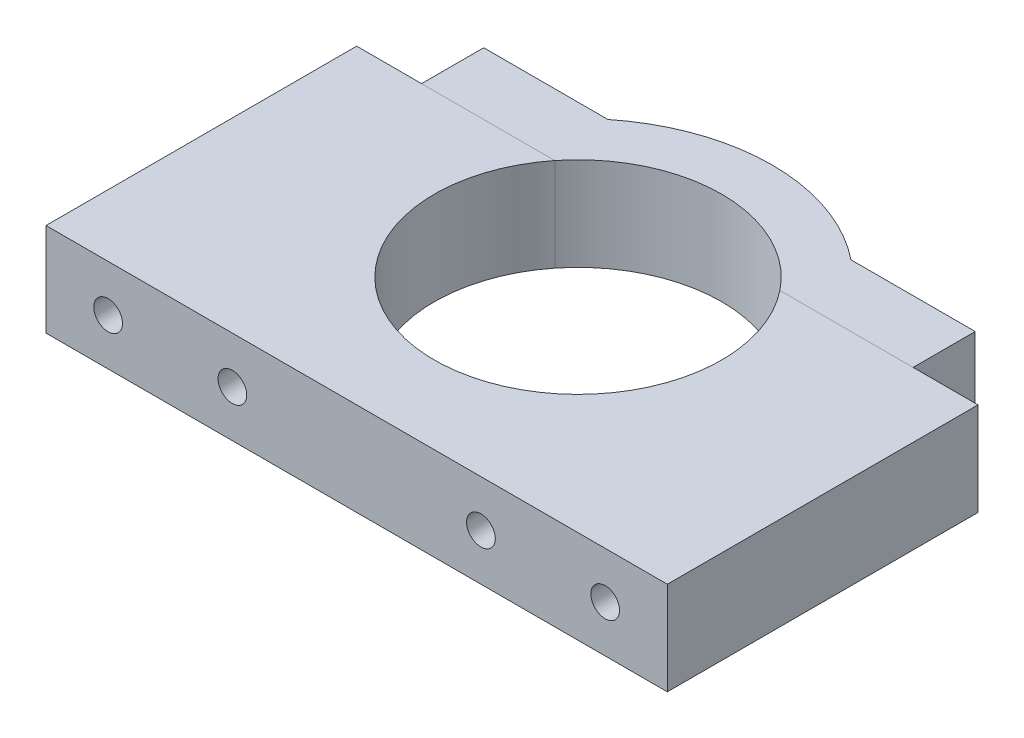
ISO-10303-21;
HEADER;
FILE_DESCRIPTION(('STEP AP214'),'2;1');
FILE_NAME('part.step','',(''),(''),'','','');
FILE_SCHEMA(('AUTOMOTIVE_DESIGN { 1 0 10303 214 1 1 1 1 }'));
ENDSEC;
DATA;
#1=APPLICATION_CONTEXT('core data for automotive mechanical design processes');
#2=APPLICATION_PROTOCOL_DEFINITION('international standard','automotive_design',2000,#1);
#3=PRODUCT_CONTEXT('',#1,'mechanical');
#4=PRODUCT('Part','Part','',(#3));
#5=PRODUCT_RELATED_PRODUCT_CATEGORY('part','',(#4));
#6=PRODUCT_DEFINITION_FORMATION('','',#4);
#7=PRODUCT_DEFINITION_CONTEXT('part definition',#1,'design');
#8=PRODUCT_DEFINITION('design','',#6,#7);
#9=PRODUCT_DEFINITION_SHAPE('','',#8);
#10=(LENGTH_UNIT() NAMED_UNIT(*) SI_UNIT(.MILLI.,.METRE.));
#11=(NAMED_UNIT(*) PLANE_ANGLE_UNIT() SI_UNIT($,.RADIAN.));
#12=(NAMED_UNIT(*) SI_UNIT($,.STERADIAN.) SOLID_ANGLE_UNIT());
#13=UNCERTAINTY_MEASURE_WITH_UNIT(LENGTH_MEASURE(1.E-05),#10,'distance_accuracy_value','');
#14=(GEOMETRIC_REPRESENTATION_CONTEXT(3) GLOBAL_UNCERTAINTY_ASSIGNED_CONTEXT((#13)) GLOBAL_UNIT_ASSIGNED_CONTEXT((#10,
#11,#12)) REPRESENTATION_CONTEXT('',''));
#15=CARTESIAN_POINT('',(0.,0.,0.));
#16=DIRECTION('',(0.,0.,1.));
#17=DIRECTION('',(1.,0.,0.));
#18=AXIS2_PLACEMENT_3D('',#15,#16,#17);
#19=CARTESIAN_POINT('',(0.,6.,-19.5));
#20=DIRECTION('',(0.,0.,1.));
#21=DIRECTION('',(1.,0.,0.));
#22=AXIS2_PLACEMENT_3D('',#19,#20,#21);
#23=PLANE('',#22);
#24=DIRECTION('',(-1.,0.,0.));
#25=VECTOR('',#24,1.);
#26=CARTESIAN_POINT('',(0.,-6.,-19.5));
#27=LINE('',#26,#25);
#28=CARTESIAN_POINT('',(31.644487847162,-6.,-19.5));
#29=VERTEX_POINT('',#28);
#30=CARTESIAN_POINT('',(15.644487847162,-6.,-19.5));
#31=VERTEX_POINT('',#30);
#32=EDGE_CURVE('E140',#29,#31,#27,.T.);
#33=ORIENTED_EDGE('',*,*,#32,.T.);
#34=DIRECTION('',(0.,-1.,0.));
#35=VECTOR('',#34,1.);
#36=CARTESIAN_POINT('',(15.644487847162,6.,-19.5));
#37=LINE('',#36,#35);
#38=CARTESIAN_POINT('',(15.644487847162,6.,-19.5));
#39=VERTEX_POINT('',#38);
#40=EDGE_CURVE('E12',#39,#31,#37,.T.);
#41=ORIENTED_EDGE('',*,*,#40,.F.);
#42=DIRECTION('',(-1.,0.,0.));
#43=VECTOR('',#42,1.);
#44=CARTESIAN_POINT('',(0.,6.,-19.5));
#45=LINE('',#44,#43);
#46=CARTESIAN_POINT('',(31.644487847162,6.,-19.5));
#47=VERTEX_POINT('',#46);
#48=EDGE_CURVE('E159',#47,#39,#45,.T.);
#49=ORIENTED_EDGE('',*,*,#48,.F.);
#50=DIRECTION('',(0.,-1.,0.));
#51=VECTOR('',#50,1.);
#52=CARTESIAN_POINT('',(31.644487847162,6.,-19.5));
#53=LINE('',#52,#51);
#54=EDGE_CURVE('E136',#47,#29,#53,.T.);
#55=ORIENTED_EDGE('',*,*,#54,.T.);
#56=EDGE_LOOP('',(#33,#41,#49,#55));
#57=FACE_BOUND('',#56,.T.);
#58=ADVANCED_FACE('F45',(#57),#23,.F.);
#59=CARTESIAN_POINT('',(0.,6.,0.));
#60=DIRECTION('',(0.,-1.,0.));
#61=DIRECTION('',(0.,0.,-1.));
#62=AXIS2_PLACEMENT_3D('',#59,#60,#61);
#63=CYLINDRICAL_SURFACE('',#62,25.);
#64=CARTESIAN_POINT('',(0.,-6.,0.));
#65=DIRECTION('',(0.,1.,0.));
#66=DIRECTION('',(0.,0.,1.));
#67=AXIS2_PLACEMENT_3D('',#64,#65,#66);
#68=CIRCLE('',#67,25.);
#69=CARTESIAN_POINT('',(-15.644487847162,-6.,-19.5));
#70=VERTEX_POINT('',#69);
#71=EDGE_CURVE('E143',#31,#70,#68,.T.);
#72=ORIENTED_EDGE('',*,*,#71,.T.);
#73=DIRECTION('',(0.,-1.,0.));
#74=VECTOR('',#73,1.);
#75=CARTESIAN_POINT('',(-15.644487847162,6.,-19.5));
#76=LINE('',#75,#74);
#77=CARTESIAN_POINT('',(-15.644487847162,6.,-19.5));
#78=VERTEX_POINT('',#77);
#79=EDGE_CURVE('E53',#78,#70,#76,.T.);
#80=ORIENTED_EDGE('',*,*,#79,.F.);
#81=CARTESIAN_POINT('',(0.,6.,0.));
#82=DIRECTION('',(0.,1.,0.));
#83=DIRECTION('',(0.,0.,1.));
#84=AXIS2_PLACEMENT_3D('',#81,#82,#83);
#85=CIRCLE('',#84,25.);
#86=EDGE_CURVE('E100',#39,#78,#85,.T.);
#87=ORIENTED_EDGE('',*,*,#86,.F.);
#88=ORIENTED_EDGE('',*,*,#40,.T.);
#89=EDGE_LOOP('',(#72,#80,#87,#88));
#90=FACE_BOUND('',#89,.T.);
#91=ADVANCED_FACE('F172',(#90),#63,.T.);
#92=CARTESIAN_POINT('',(0.,6.,-19.5));
#93=DIRECTION('',(0.,0.,-1.));
#94=DIRECTION('',(-1.,0.,0.));
#95=AXIS2_PLACEMENT_3D('',#92,#93,#94);
#96=PLANE('',#95);
#97=DIRECTION('',(1.,0.,0.));
#98=VECTOR('',#97,1.);
#99=CARTESIAN_POINT('',(0.,-6.,-19.5));
#100=LINE('',#99,#98);
#101=CARTESIAN_POINT('',(-31.644487847162,-6.,-19.5));
#102=VERTEX_POINT('',#101);
#103=EDGE_CURVE('E146',#102,#70,#100,.T.);
#104=ORIENTED_EDGE('',*,*,#103,.F.);
#105=DIRECTION('',(0.,-1.,0.));
#106=VECTOR('',#105,1.);
#107=CARTESIAN_POINT('',(-31.644487847162,6.,-19.5));
#108=LINE('',#107,#106);
#109=CARTESIAN_POINT('',(-31.644487847162,6.,-19.5));
#110=VERTEX_POINT('',#109);
#111=EDGE_CURVE('E165',#110,#102,#108,.T.);
#112=ORIENTED_EDGE('',*,*,#111,.F.);
#113=DIRECTION('',(1.,0.,0.));
#114=VECTOR('',#113,1.);
#115=CARTESIAN_POINT('',(0.,6.,-19.5));
#116=LINE('',#115,#114);
#117=EDGE_CURVE('E171',#110,#78,#116,.T.);
#118=ORIENTED_EDGE('',*,*,#117,.T.);
#119=ORIENTED_EDGE('',*,*,#79,.T.);
#120=EDGE_LOOP('',(#104,#112,#118,#119));
#121=FACE_BOUND('',#120,.T.);
#122=ADVANCED_FACE('F169',(#121),#96,.T.);
#123=CARTESIAN_POINT('',(-31.644487847162,6.,0.));
#124=DIRECTION('',(-1.,0.,0.));
#125=DIRECTION('',(0.,0.,1.));
#126=AXIS2_PLACEMENT_3D('',#123,#124,#125);
#127=PLANE('',#126);
#128=DIRECTION('',(0.,0.,-1.));
#129=VECTOR('',#128,1.);
#130=CARTESIAN_POINT('',(-31.644487847162,-6.,0.));
#131=LINE('',#130,#129);
#132=CARTESIAN_POINT('',(-31.644487847162,-6.,-11.5));
#133=VERTEX_POINT('',#132);
#134=EDGE_CURVE('E149',#133,#102,#131,.T.);
#135=ORIENTED_EDGE('',*,*,#134,.F.);
#136=DIRECTION('',(0.,-1.,0.));
#137=VECTOR('',#136,1.);
#138=CARTESIAN_POINT('',(-31.644487847162,6.,-11.5));
#139=LINE('',#138,#137);
#140=CARTESIAN_POINT('',(-31.644487847162,6.,-11.5));
#141=VERTEX_POINT('',#140);
#142=EDGE_CURVE('E163',#141,#133,#139,.T.);
#143=ORIENTED_EDGE('',*,*,#142,.F.);
#144=DIRECTION('',(0.,0.,-1.));
#145=VECTOR('',#144,1.);
#146=CARTESIAN_POINT('',(-31.644487847162,6.,0.));
#147=LINE('',#146,#145);
#148=EDGE_CURVE('E182',#141,#110,#147,.T.);
#149=ORIENTED_EDGE('',*,*,#148,.T.);
#150=ORIENTED_EDGE('',*,*,#111,.T.);
#151=EDGE_LOOP('',(#135,#143,#149,#150));
#152=FACE_BOUND('',#151,.T.);
#153=ADVANCED_FACE('F180',(#152),#127,.T.);
#154=CARTESIAN_POINT('',(0.,6.,-11.5));
#155=DIRECTION('',(0.,0.,-1.));
#156=DIRECTION('',(-1.,0.,0.));
#157=AXIS2_PLACEMENT_3D('',#154,#155,#156);
#158=PLANE('',#157);
#159=DIRECTION('',(1.,0.,0.));
#160=VECTOR('',#159,1.);
#161=CARTESIAN_POINT('',(0.,-6.,-11.5));
#162=LINE('',#161,#160);
#163=CARTESIAN_POINT('',(-14.4913767461894,-6.,-11.5));
#164=VERTEX_POINT('',#163);
#165=EDGE_CURVE('E152',#133,#164,#162,.T.);
#166=ORIENTED_EDGE('',*,*,#165,.T.);
#167=DIRECTION('',(0.,-1.,0.));
#168=VECTOR('',#167,1.);
#169=CARTESIAN_POINT('',(-14.4913767461894,6.,-11.5));
#170=LINE('',#169,#168);
#171=CARTESIAN_POINT('',(-14.4913767461894,6.,-11.5));
#172=VERTEX_POINT('',#171);
#173=EDGE_CURVE('E125',#172,#164,#170,.T.);
#174=ORIENTED_EDGE('',*,*,#173,.F.);
#175=DIRECTION('',(1.,0.,0.));
#176=VECTOR('',#175,1.);
#177=CARTESIAN_POINT('',(0.,6.,-11.5));
#178=LINE('',#177,#176);
#179=EDGE_CURVE('E131',#141,#172,#178,.T.);
#180=ORIENTED_EDGE('',*,*,#179,.F.);
#181=ORIENTED_EDGE('',*,*,#142,.T.);
#182=EDGE_LOOP('',(#166,#174,#180,#181));
#183=FACE_BOUND('',#182,.T.);
#184=ADVANCED_FACE('F210',(#183),#158,.F.);
#185=CARTESIAN_POINT('',(0.,6.,0.));
#186=DIRECTION('',(0.,-1.,0.));
#187=DIRECTION('',(0.,0.,-1.));
#188=AXIS2_PLACEMENT_3D('',#185,#186,#187);
#189=CYLINDRICAL_SURFACE('',#188,18.5);
#190=CARTESIAN_POINT('',(0.,-6.,0.));
#191=DIRECTION('',(0.,1.,0.));
#192=DIRECTION('',(0.,0.,1.));
#193=AXIS2_PLACEMENT_3D('',#190,#191,#192);
#194=CIRCLE('',#193,18.5);
#195=CARTESIAN_POINT('',(14.4913767461894,-6.,-11.5));
#196=VERTEX_POINT('',#195);
#197=EDGE_CURVE('E120',#196,#164,#194,.T.);
#198=ORIENTED_EDGE('',*,*,#197,.F.);
#199=DIRECTION('',(0.,-1.,0.));
#200=VECTOR('',#199,1.);
#201=CARTESIAN_POINT('',(14.4913767461894,6.,-11.5));
#202=LINE('',#201,#200);
#203=CARTESIAN_POINT('',(14.4913767461894,6.,-11.5));
#204=VERTEX_POINT('',#203);
#205=EDGE_CURVE('E115',#204,#196,#202,.T.);
#206=ORIENTED_EDGE('',*,*,#205,.F.);
#207=CARTESIAN_POINT('',(0.,6.,0.));
#208=DIRECTION('',(0.,1.,0.));
#209=DIRECTION('',(0.,0.,1.));
#210=AXIS2_PLACEMENT_3D('',#207,#208,#209);
#211=CIRCLE('',#210,18.5);
#212=EDGE_CURVE('E118',#204,#172,#211,.T.);
#213=ORIENTED_EDGE('',*,*,#212,.T.);
#214=ORIENTED_EDGE('',*,*,#173,.T.);
#215=EDGE_LOOP('',(#198,#206,#213,#214));
#216=FACE_BOUND('',#215,.T.);
#217=ADVANCED_FACE('F117',(#216),#189,.F.);
#218=CARTESIAN_POINT('',(0.,6.,-11.5));
#219=DIRECTION('',(0.,0.,1.));
#220=DIRECTION('',(1.,0.,0.));
#221=AXIS2_PLACEMENT_3D('',#218,#219,#220);
#222=PLANE('',#221);
#223=DIRECTION('',(-1.,0.,0.));
#224=VECTOR('',#223,1.);
#225=CARTESIAN_POINT('',(0.,-6.,-11.5));
#226=LINE('',#225,#224);
#227=CARTESIAN_POINT('',(31.644487847162,-6.,-11.5));
#228=VERTEX_POINT('',#227);
#229=EDGE_CURVE('E156',#228,#196,#226,.T.);
#230=ORIENTED_EDGE('',*,*,#229,.F.);
#231=DIRECTION('',(0.,-1.,0.));
#232=VECTOR('',#231,1.);
#233=CARTESIAN_POINT('',(31.644487847162,6.,-11.5));
#234=LINE('',#233,#232);
#235=CARTESIAN_POINT('',(31.644487847162,6.,-11.5));
#236=VERTEX_POINT('',#235);
#237=EDGE_CURVE('E89',#236,#228,#234,.T.);
#238=ORIENTED_EDGE('',*,*,#237,.F.);
#239=DIRECTION('',(-1.,0.,0.));
#240=VECTOR('',#239,1.);
#241=CARTESIAN_POINT('',(0.,6.,-11.5));
#242=LINE('',#241,#240);
#243=EDGE_CURVE('E128',#236,#204,#242,.T.);
#244=ORIENTED_EDGE('',*,*,#243,.T.);
#245=ORIENTED_EDGE('',*,*,#205,.T.);
#246=EDGE_LOOP('',(#230,#238,#244,#245));
#247=FACE_BOUND('',#246,.T.);
#248=ADVANCED_FACE('F134',(#247),#222,.T.);
#249=CARTESIAN_POINT('',(31.644487847162,6.,0.));
#250=DIRECTION('',(-1.,0.,0.));
#251=DIRECTION('',(0.,0.,1.));
#252=AXIS2_PLACEMENT_3D('',#249,#250,#251);
#253=PLANE('',#252);
#254=DIRECTION('',(0.,0.,-1.));
#255=VECTOR('',#254,1.);
#256=CARTESIAN_POINT('',(31.644487847162,-6.,0.));
#257=LINE('',#256,#255);
#258=EDGE_CURVE('E92',#228,#29,#257,.T.);
#259=ORIENTED_EDGE('',*,*,#258,.T.);
#260=ORIENTED_EDGE('',*,*,#54,.F.);
#261=DIRECTION('',(0.,0.,-1.));
#262=VECTOR('',#261,1.);
#263=CARTESIAN_POINT('',(31.644487847162,6.,0.));
#264=LINE('',#263,#262);
#265=EDGE_CURVE('E61',#236,#47,#264,.T.);
#266=ORIENTED_EDGE('',*,*,#265,.F.);
#267=ORIENTED_EDGE('',*,*,#237,.T.);
#268=EDGE_LOOP('',(#259,#260,#266,#267));
#269=FACE_BOUND('',#268,.T.);
#270=ADVANCED_FACE('F189',(#269),#253,.F.);
#271=CARTESIAN_POINT('',(0.,6.,0.));
#272=DIRECTION('',(0.,1.,0.));
#273=DIRECTION('',(0.,0.,1.));
#274=AXIS2_PLACEMENT_3D('',#271,#272,#273);
#275=PLANE('',#274);
#276=ORIENTED_EDGE('',*,*,#48,.T.);
#277=ORIENTED_EDGE('',*,*,#86,.T.);
#278=ORIENTED_EDGE('',*,*,#117,.F.);
#279=ORIENTED_EDGE('',*,*,#148,.F.);
#280=ORIENTED_EDGE('',*,*,#179,.T.);
#281=ORIENTED_EDGE('',*,*,#212,.F.);
#282=ORIENTED_EDGE('',*,*,#243,.F.);
#283=ORIENTED_EDGE('',*,*,#265,.T.);
#284=EDGE_LOOP('',(#276,#277,#278,#279,#280,#281,#282,#283));
#285=FACE_BOUND('',#284,.T.);
#286=ADVANCED_FACE('F127',(#285),#275,.T.);
#287=CARTESIAN_POINT('',(0.,-6.,0.));
#288=DIRECTION('',(0.,1.,0.));
#289=DIRECTION('',(0.,0.,1.));
#290=AXIS2_PLACEMENT_3D('',#287,#288,#289);
#291=PLANE('',#290);
#292=ORIENTED_EDGE('',*,*,#32,.F.);
#293=ORIENTED_EDGE('',*,*,#258,.F.);
#294=ORIENTED_EDGE('',*,*,#229,.T.);
#295=ORIENTED_EDGE('',*,*,#197,.T.);
#296=ORIENTED_EDGE('',*,*,#165,.F.);
#297=ORIENTED_EDGE('',*,*,#134,.T.);
#298=ORIENTED_EDGE('',*,*,#103,.T.);
#299=ORIENTED_EDGE('',*,*,#71,.F.);
#300=EDGE_LOOP('',(#292,#293,#294,#295,#296,#297,#298,#299));
#301=FACE_BOUND('',#300,.T.);
#302=ADVANCED_FACE('F176',(#301),#291,.F.);
#303=CLOSED_SHELL('',(#58,#91,#122,#153,#184,#217,#248,#270,#286,#302));
#304=MANIFOLD_SOLID_BREP('B2',#303);
#305=CARTESIAN_POINT('',(0.,6.,0.));
#306=DIRECTION('',(0.,-1.,0.));
#307=DIRECTION('',(0.,0.,-1.));
#308=AXIS2_PLACEMENT_3D('',#305,#306,#307);
#309=CYLINDRICAL_SURFACE('',#308,18.5);
#310=CARTESIAN_POINT('',(0.,-6.,0.));
#311=DIRECTION('',(0.,1.,0.));
#312=DIRECTION('',(0.,0.,1.));
#313=AXIS2_PLACEMENT_3D('',#310,#311,#312);
#314=CIRCLE('',#313,18.5);
#315=CARTESIAN_POINT('',(-14.4913767461894,-6.,-11.5));
#316=VERTEX_POINT('',#315);
#317=CARTESIAN_POINT('',(14.4913767461894,-6.,-11.5));
#318=VERTEX_POINT('',#317);
#319=EDGE_CURVE('E353',#316,#318,#314,.T.);
#320=ORIENTED_EDGE('',*,*,#319,.F.);
#321=DIRECTION('',(0.,-1.,0.));
#322=VECTOR('',#321,1.);
#323=CARTESIAN_POINT('',(-14.4913767461894,6.,-11.5));
#324=LINE('',#323,#322);
#325=CARTESIAN_POINT('',(-14.4913767461894,6.,-11.5));
#326=VERTEX_POINT('',#325);
#327=EDGE_CURVE('E43',#326,#316,#324,.T.);
#328=ORIENTED_EDGE('',*,*,#327,.F.);
#329=CARTESIAN_POINT('',(0.,6.,0.));
#330=DIRECTION('',(0.,1.,0.));
#331=DIRECTION('',(0.,0.,1.));
#332=AXIS2_PLACEMENT_3D('',#329,#330,#331);
#333=CIRCLE('',#332,18.5);
#334=CARTESIAN_POINT('',(14.4913767461894,6.,-11.5));
#335=VERTEX_POINT('',#334);
#336=EDGE_CURVE('E367',#326,#335,#333,.T.);
#337=ORIENTED_EDGE('',*,*,#336,.T.);
#338=DIRECTION('',(0.,-1.,0.));
#339=VECTOR('',#338,1.);
#340=CARTESIAN_POINT('',(14.4913767461894,6.,-11.5));
#341=LINE('',#340,#339);
#342=EDGE_CURVE('E318',#335,#318,#341,.T.);
#343=ORIENTED_EDGE('',*,*,#342,.T.);
#344=EDGE_LOOP('',(#320,#328,#337,#343));
#345=FACE_BOUND('',#344,.T.);
#346=ADVANCED_FACE('F273',(#345),#309,.F.);
#347=CARTESIAN_POINT('',(0.,6.,-11.5));
#348=DIRECTION('',(0.,0.,-1.));
#349=DIRECTION('',(-1.,0.,0.));
#350=AXIS2_PLACEMENT_3D('',#347,#348,#349);
#351=PLANE('',#350);
#352=DIRECTION('',(1.,0.,0.));
#353=VECTOR('',#352,1.);
#354=CARTESIAN_POINT('',(0.,-6.,-11.5));
#355=LINE('',#354,#353);
#356=CARTESIAN_POINT('',(-40.,-6.,-11.5));
#357=VERTEX_POINT('',#356);
#358=EDGE_CURVE('E356',#357,#316,#355,.T.);
#359=ORIENTED_EDGE('',*,*,#358,.F.);
#360=DIRECTION('',(0.,-1.,0.));
#361=VECTOR('',#360,1.);
#362=CARTESIAN_POINT('',(-40.,6.,-11.5));
#363=LINE('',#362,#361);
#364=CARTESIAN_POINT('',(-40.,6.,-11.5));
#365=VERTEX_POINT('',#364);
#366=EDGE_CURVE('E281',#365,#357,#363,.T.);
#367=ORIENTED_EDGE('',*,*,#366,.F.);
#368=DIRECTION('',(1.,0.,0.));
#369=VECTOR('',#368,1.);
#370=CARTESIAN_POINT('',(0.,6.,-11.5));
#371=LINE('',#370,#369);
#372=EDGE_CURVE('E382',#365,#326,#371,.T.);
#373=ORIENTED_EDGE('',*,*,#372,.T.);
#374=ORIENTED_EDGE('',*,*,#327,.T.);
#375=EDGE_LOOP('',(#359,#367,#373,#374));
#376=FACE_BOUND('',#375,.T.);
#377=ADVANCED_FACE('F376',(#376),#351,.T.);
#378=CARTESIAN_POINT('',(-40.,6.,0.));
#379=DIRECTION('',(-1.,0.,0.));
#380=DIRECTION('',(0.,0.,1.));
#381=AXIS2_PLACEMENT_3D('',#378,#379,#380);
#382=PLANE('',#381);
#383=DIRECTION('',(0.,0.,-1.));
#384=VECTOR('',#383,1.);
#385=CARTESIAN_POINT('',(-40.,-6.,0.));
#386=LINE('',#385,#384);
#387=CARTESIAN_POINT('',(-40.,-6.,28.5));
#388=VERTEX_POINT('',#387);
#389=EDGE_CURVE('E360',#388,#357,#386,.T.);
#390=ORIENTED_EDGE('',*,*,#389,.F.);
#391=DIRECTION('',(0.,-1.,0.));
#392=VECTOR('',#391,1.);
#393=CARTESIAN_POINT('',(-40.,6.,28.5));
#394=LINE('',#393,#392);
#395=CARTESIAN_POINT('',(-40.,6.,28.5));
#396=VERTEX_POINT('',#395);
#397=EDGE_CURVE('E345',#396,#388,#394,.T.);
#398=ORIENTED_EDGE('',*,*,#397,.F.);
#399=DIRECTION('',(0.,0.,-1.));
#400=VECTOR('',#399,1.);
#401=CARTESIAN_POINT('',(-40.,6.,0.));
#402=LINE('',#401,#400);
#403=EDGE_CURVE('E338',#396,#365,#402,.T.);
#404=ORIENTED_EDGE('',*,*,#403,.T.);
#405=ORIENTED_EDGE('',*,*,#366,.T.);
#406=EDGE_LOOP('',(#390,#398,#404,#405));
#407=FACE_BOUND('',#406,.T.);
#408=ADVANCED_FACE('F373',(#407),#382,.T.);
#409=CARTESIAN_POINT('',(0.,6.,28.5));
#410=DIRECTION('',(0.,0.,-1.));
#411=DIRECTION('',(-1.,0.,0.));
#412=AXIS2_PLACEMENT_3D('',#409,#410,#411);
#413=PLANE('',#412);
#414=CARTESIAN_POINT('',(-32.,0.,28.5));
#415=DIRECTION('',(0.,0.,1.));
#416=DIRECTION('',(-1.,0.,0.));
#417=AXIS2_PLACEMENT_3D('',#414,#415,#416);
#418=CIRCLE('',#417,1.85);
#419=CARTESIAN_POINT('',(-33.85,0.,28.5));
#420=VERTEX_POINT('',#419);
#421=EDGE_CURVE('E404',#420,#420,#418,.T.);
#422=ORIENTED_EDGE('',*,*,#421,.F.);
#423=EDGE_LOOP('',(#422));
#424=FACE_BOUND('',#423,.T.);
#425=CARTESIAN_POINT('',(-16.,0.,28.5));
#426=DIRECTION('',(0.,0.,1.));
#427=DIRECTION('',(-1.,0.,0.));
#428=AXIS2_PLACEMENT_3D('',#425,#426,#427);
#429=CIRCLE('',#428,1.85);
#430=CARTESIAN_POINT('',(-17.85,0.,28.5));
#431=VERTEX_POINT('',#430);
#432=EDGE_CURVE('E398',#431,#431,#429,.T.);
#433=ORIENTED_EDGE('',*,*,#432,.F.);
#434=EDGE_LOOP('',(#433));
#435=FACE_BOUND('',#434,.T.);
#436=CARTESIAN_POINT('',(16.,0.,28.5));
#437=DIRECTION('',(0.,0.,1.));
#438=DIRECTION('',(1.,0.,0.));
#439=AXIS2_PLACEMENT_3D('',#436,#437,#438);
#440=CIRCLE('',#439,1.85);
#441=CARTESIAN_POINT('',(17.85,0.,28.5));
#442=VERTEX_POINT('',#441);
#443=EDGE_CURVE('E392',#442,#442,#440,.T.);
#444=ORIENTED_EDGE('',*,*,#443,.F.);
#445=EDGE_LOOP('',(#444));
#446=FACE_BOUND('',#445,.T.);
#447=CARTESIAN_POINT('',(32.,0.,28.5));
#448=DIRECTION('',(0.,0.,1.));
#449=DIRECTION('',(1.,0.,0.));
#450=AXIS2_PLACEMENT_3D('',#447,#448,#449);
#451=CIRCLE('',#450,1.85);
#452=CARTESIAN_POINT('',(33.85,0.,28.5));
#453=VERTEX_POINT('',#452);
#454=EDGE_CURVE('E386',#453,#453,#451,.T.);
#455=ORIENTED_EDGE('',*,*,#454,.F.);
#456=EDGE_LOOP('',(#455));
#457=FACE_BOUND('',#456,.T.);
#458=DIRECTION('',(1.,0.,0.));
#459=VECTOR('',#458,1.);
#460=CARTESIAN_POINT('',(0.,-6.,28.5));
#461=LINE('',#460,#459);
#462=CARTESIAN_POINT('',(40.,-6.,28.5));
#463=VERTEX_POINT('',#462);
#464=EDGE_CURVE('E344',#388,#463,#461,.T.);
#465=ORIENTED_EDGE('',*,*,#464,.T.);
#466=DIRECTION('',(0.,-1.,0.));
#467=VECTOR('',#466,1.);
#468=CARTESIAN_POINT('',(40.,6.,28.5));
#469=LINE('',#468,#467);
#470=CARTESIAN_POINT('',(40.,6.,28.5));
#471=VERTEX_POINT('',#470);
#472=EDGE_CURVE('E341',#471,#463,#469,.T.);
#473=ORIENTED_EDGE('',*,*,#472,.F.);
#474=DIRECTION('',(1.,0.,0.));
#475=VECTOR('',#474,1.);
#476=CARTESIAN_POINT('',(0.,6.,28.5));
#477=LINE('',#476,#475);
#478=EDGE_CURVE('E331',#396,#471,#477,.T.);
#479=ORIENTED_EDGE('',*,*,#478,.F.);
#480=ORIENTED_EDGE('',*,*,#397,.T.);
#481=EDGE_LOOP('',(#465,#473,#479,#480));
#482=FACE_BOUND('',#481,.T.);
#483=ADVANCED_FACE('F342',(#424,#435,#446,#457,#482),#413,.F.);
#484=CARTESIAN_POINT('',(40.,6.,0.));
#485=DIRECTION('',(-1.,0.,0.));
#486=DIRECTION('',(0.,0.,1.));
#487=AXIS2_PLACEMENT_3D('',#484,#485,#486);
#488=PLANE('',#487);
#489=DIRECTION('',(0.,0.,-1.));
#490=VECTOR('',#489,1.);
#491=CARTESIAN_POINT('',(40.,-6.,0.));
#492=LINE('',#491,#490);
#493=CARTESIAN_POINT('',(40.,-6.,-11.5));
#494=VERTEX_POINT('',#493);
#495=EDGE_CURVE('E311',#463,#494,#492,.T.);
#496=ORIENTED_EDGE('',*,*,#495,.T.);
#497=DIRECTION('',(0.,-1.,0.));
#498=VECTOR('',#497,1.);
#499=CARTESIAN_POINT('',(40.,6.,-11.5));
#500=LINE('',#499,#498);
#501=CARTESIAN_POINT('',(40.,6.,-11.5));
#502=VERTEX_POINT('',#501);
#503=EDGE_CURVE('E346',#502,#494,#500,.T.);
#504=ORIENTED_EDGE('',*,*,#503,.F.);
#505=DIRECTION('',(0.,0.,-1.));
#506=VECTOR('',#505,1.);
#507=CARTESIAN_POINT('',(40.,6.,0.));
#508=LINE('',#507,#506);
#509=EDGE_CURVE('E335',#471,#502,#508,.T.);
#510=ORIENTED_EDGE('',*,*,#509,.F.);
#511=ORIENTED_EDGE('',*,*,#472,.T.);
#512=EDGE_LOOP('',(#496,#504,#510,#511));
#513=FACE_BOUND('',#512,.T.);
#514=ADVANCED_FACE('F348',(#513),#488,.F.);
#515=CARTESIAN_POINT('',(0.,6.,-11.5));
#516=DIRECTION('',(0.,0.,1.));
#517=DIRECTION('',(1.,0.,0.));
#518=AXIS2_PLACEMENT_3D('',#515,#516,#517);
#519=PLANE('',#518);
#520=DIRECTION('',(-1.,0.,0.));
#521=VECTOR('',#520,1.);
#522=CARTESIAN_POINT('',(0.,-6.,-11.5));
#523=LINE('',#522,#521);
#524=EDGE_CURVE('E365',#494,#318,#523,.T.);
#525=ORIENTED_EDGE('',*,*,#524,.T.);
#526=ORIENTED_EDGE('',*,*,#342,.F.);
#527=DIRECTION('',(-1.,0.,0.));
#528=VECTOR('',#527,1.);
#529=CARTESIAN_POINT('',(0.,6.,-11.5));
#530=LINE('',#529,#528);
#531=EDGE_CURVE('E289',#502,#335,#530,.T.);
#532=ORIENTED_EDGE('',*,*,#531,.F.);
#533=ORIENTED_EDGE('',*,*,#503,.T.);
#534=EDGE_LOOP('',(#525,#526,#532,#533));
#535=FACE_BOUND('',#534,.T.);
#536=ADVANCED_FACE('F381',(#535),#519,.F.);
#537=CARTESIAN_POINT('',(0.,6.,0.));
#538=DIRECTION('',(0.,1.,0.));
#539=DIRECTION('',(0.,0.,1.));
#540=AXIS2_PLACEMENT_3D('',#537,#538,#539);
#541=PLANE('',#540);
#542=ORIENTED_EDGE('',*,*,#336,.F.);
#543=ORIENTED_EDGE('',*,*,#372,.F.);
#544=ORIENTED_EDGE('',*,*,#403,.F.);
#545=ORIENTED_EDGE('',*,*,#478,.T.);
#546=ORIENTED_EDGE('',*,*,#509,.T.);
#547=ORIENTED_EDGE('',*,*,#531,.T.);
#548=EDGE_LOOP('',(#542,#543,#544,#545,#546,#547));
#549=FACE_BOUND('',#548,.T.);
#550=ADVANCED_FACE('F333',(#549),#541,.T.);
#551=CARTESIAN_POINT('',(0.,-6.,0.));
#552=DIRECTION('',(0.,1.,0.));
#553=DIRECTION('',(0.,0.,1.));
#554=AXIS2_PLACEMENT_3D('',#551,#552,#553);
#555=PLANE('',#554);
#556=ORIENTED_EDGE('',*,*,#319,.T.);
#557=ORIENTED_EDGE('',*,*,#524,.F.);
#558=ORIENTED_EDGE('',*,*,#495,.F.);
#559=ORIENTED_EDGE('',*,*,#464,.F.);
#560=ORIENTED_EDGE('',*,*,#389,.T.);
#561=ORIENTED_EDGE('',*,*,#358,.T.);
#562=EDGE_LOOP('',(#556,#557,#558,#559,#560,#561));
#563=FACE_BOUND('',#562,.T.);
#564=ADVANCED_FACE('F378',(#563),#555,.F.);
#565=CARTESIAN_POINT('',(32.,0.,20.5));
#566=DIRECTION('',(0.,0.,1.));
#567=DIRECTION('',(1.,0.,0.));
#568=AXIS2_PLACEMENT_3D('',#565,#566,#567);
#569=CYLINDRICAL_SURFACE('',#568,1.85);
#570=CARTESIAN_POINT('',(32.,0.,20.5));
#571=DIRECTION('',(0.,0.,1.));
#572=DIRECTION('',(1.,0.,0.));
#573=AXIS2_PLACEMENT_3D('',#570,#571,#572);
#574=CIRCLE('',#573,1.85);
#575=CARTESIAN_POINT('',(33.85,0.,20.5));
#576=VERTEX_POINT('',#575);
#577=EDGE_CURVE('E357',#576,#576,#574,.T.);
#578=ORIENTED_EDGE('',*,*,#577,.F.);
#579=EDGE_LOOP('',(#578));
#580=FACE_BOUND('',#579,.T.);
#581=ORIENTED_EDGE('',*,*,#454,.T.);
#582=EDGE_LOOP('',(#581));
#583=FACE_BOUND('',#582,.T.);
#584=ADVANCED_FACE('F428',(#580,#583),#569,.F.);
#585=CARTESIAN_POINT('',(32.,0.,20.5));
#586=DIRECTION('',(0.,0.,1.));
#587=DIRECTION('',(1.,0.,0.));
#588=AXIS2_PLACEMENT_3D('',#585,#586,#587);
#589=PLANE('',#588);
#590=ORIENTED_EDGE('',*,*,#577,.T.);
#591=EDGE_LOOP('',(#590));
#592=FACE_BOUND('',#591,.T.);
#593=ADVANCED_FACE('F430',(#592),#589,.T.);
#594=CARTESIAN_POINT('',(16.,0.,20.5));
#595=DIRECTION('',(0.,0.,1.));
#596=DIRECTION('',(1.,0.,0.));
#597=AXIS2_PLACEMENT_3D('',#594,#595,#596);
#598=CYLINDRICAL_SURFACE('',#597,1.85);
#599=CARTESIAN_POINT('',(16.,0.,20.5));
#600=DIRECTION('',(0.,0.,1.));
#601=DIRECTION('',(1.,0.,0.));
#602=AXIS2_PLACEMENT_3D('',#599,#600,#601);
#603=CIRCLE('',#602,1.85);
#604=CARTESIAN_POINT('',(17.85,0.,20.5));
#605=VERTEX_POINT('',#604);
#606=EDGE_CURVE('E389',#605,#605,#603,.T.);
#607=ORIENTED_EDGE('',*,*,#606,.F.);
#608=EDGE_LOOP('',(#607));
#609=FACE_BOUND('',#608,.T.);
#610=ORIENTED_EDGE('',*,*,#443,.T.);
#611=EDGE_LOOP('',(#610));
#612=FACE_BOUND('',#611,.T.);
#613=ADVANCED_FACE('F437',(#609,#612),#598,.F.);
#614=CARTESIAN_POINT('',(16.,0.,20.5));
#615=DIRECTION('',(0.,0.,1.));
#616=DIRECTION('',(1.,0.,0.));
#617=AXIS2_PLACEMENT_3D('',#614,#615,#616);
#618=PLANE('',#617);
#619=ORIENTED_EDGE('',*,*,#606,.T.);
#620=EDGE_LOOP('',(#619));
#621=FACE_BOUND('',#620,.T.);
#622=ADVANCED_FACE('F492',(#621),#618,.T.);
#623=CARTESIAN_POINT('',(-16.,0.,20.5));
#624=DIRECTION('',(0.,0.,1.));
#625=DIRECTION('',(1.,0.,0.));
#626=AXIS2_PLACEMENT_3D('',#623,#624,#625);
#627=CYLINDRICAL_SURFACE('',#626,1.85);
#628=CARTESIAN_POINT('',(-16.,0.,20.5));
#629=DIRECTION('',(0.,0.,1.));
#630=DIRECTION('',(-1.,0.,0.));
#631=AXIS2_PLACEMENT_3D('',#628,#629,#630);
#632=CIRCLE('',#631,1.85);
#633=CARTESIAN_POINT('',(-17.85,0.,20.5));
#634=VERTEX_POINT('',#633);
#635=EDGE_CURVE('E395',#634,#634,#632,.T.);
#636=ORIENTED_EDGE('',*,*,#635,.F.);
#637=EDGE_LOOP('',(#636));
#638=FACE_BOUND('',#637,.T.);
#639=ORIENTED_EDGE('',*,*,#432,.T.);
#640=EDGE_LOOP('',(#639));
#641=FACE_BOUND('',#640,.T.);
#642=ADVANCED_FACE('F502',(#638,#641),#627,.F.);
#643=CARTESIAN_POINT('',(-16.,0.,20.5));
#644=DIRECTION('',(0.,0.,-1.));
#645=DIRECTION('',(-1.,0.,0.));
#646=AXIS2_PLACEMENT_3D('',#643,#644,#645);
#647=PLANE('',#646);
#648=ORIENTED_EDGE('',*,*,#635,.T.);
#649=EDGE_LOOP('',(#648));
#650=FACE_BOUND('',#649,.T.);
#651=ADVANCED_FACE('F415',(#650),#647,.F.);
#652=CARTESIAN_POINT('',(-32.,0.,20.5));
#653=DIRECTION('',(0.,0.,1.));
#654=DIRECTION('',(1.,0.,0.));
#655=AXIS2_PLACEMENT_3D('',#652,#653,#654);
#656=CYLINDRICAL_SURFACE('',#655,1.85);
#657=CARTESIAN_POINT('',(-32.,0.,20.5));
#658=DIRECTION('',(0.,0.,1.));
#659=DIRECTION('',(-1.,0.,0.));
#660=AXIS2_PLACEMENT_3D('',#657,#658,#659);
#661=CIRCLE('',#660,1.85);
#662=CARTESIAN_POINT('',(-33.85,0.,20.5));
#663=VERTEX_POINT('',#662);
#664=EDGE_CURVE('E401',#663,#663,#661,.T.);
#665=ORIENTED_EDGE('',*,*,#664,.F.);
#666=EDGE_LOOP('',(#665));
#667=FACE_BOUND('',#666,.T.);
#668=ORIENTED_EDGE('',*,*,#421,.T.);
#669=EDGE_LOOP('',(#668));
#670=FACE_BOUND('',#669,.T.);
#671=ADVANCED_FACE('F412',(#667,#670),#656,.F.);
#672=CARTESIAN_POINT('',(-32.,0.,20.5));
#673=DIRECTION('',(0.,0.,-1.));
#674=DIRECTION('',(-1.,0.,0.));
#675=AXIS2_PLACEMENT_3D('',#672,#673,#674);
#676=PLANE('',#675);
#677=ORIENTED_EDGE('',*,*,#664,.T.);
#678=EDGE_LOOP('',(#677));
#679=FACE_BOUND('',#678,.T.);
#680=ADVANCED_FACE('F410',(#679),#676,.F.);
#681=CLOSED_SHELL('',(#346,#377,#408,#483,#514,#536,#550,#564,#584,#593,#613,#622,#642,#651,
#671,#680));
#682=MANIFOLD_SOLID_BREP('B6',#681);
#683=ADVANCED_BREP_SHAPE_REPRESENTATION('',(#18,#304,#682),#14);
#684=SHAPE_DEFINITION_REPRESENTATION(#9,#683);
ENDSEC;
END-ISO-10303-21;
